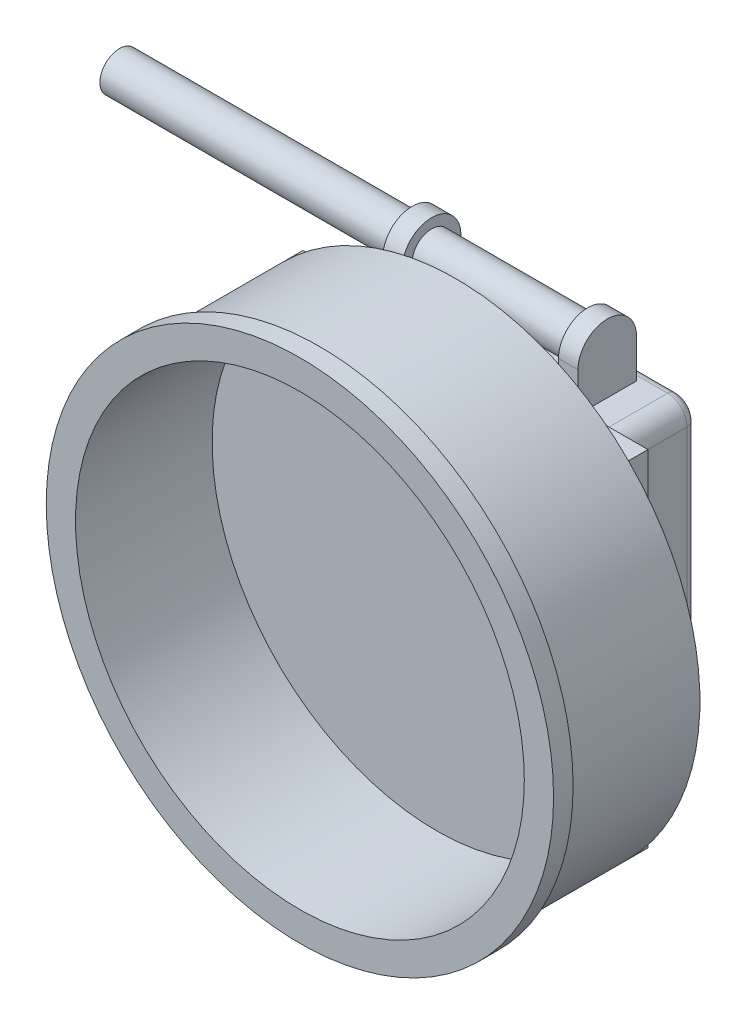
ISO-10303-21;
HEADER;
FILE_DESCRIPTION(('STEP AP214'),'2;1');
FILE_NAME('part.step','',(''),(''),'','','');
FILE_SCHEMA(('AUTOMOTIVE_DESIGN { 1 0 10303 214 1 1 1 1 }'));
ENDSEC;
DATA;
#1=APPLICATION_CONTEXT('core data for automotive mechanical design processes');
#2=APPLICATION_PROTOCOL_DEFINITION('international standard','automotive_design',2000,#1);
#3=PRODUCT_CONTEXT('',#1,'mechanical');
#4=PRODUCT('Part','Part','',(#3));
#5=PRODUCT_RELATED_PRODUCT_CATEGORY('part','',(#4));
#6=PRODUCT_DEFINITION_FORMATION('','',#4);
#7=PRODUCT_DEFINITION_CONTEXT('part definition',#1,'design');
#8=PRODUCT_DEFINITION('design','',#6,#7);
#9=PRODUCT_DEFINITION_SHAPE('','',#8);
#10=(LENGTH_UNIT() NAMED_UNIT(*) SI_UNIT(.MILLI.,.METRE.));
#11=(NAMED_UNIT(*) PLANE_ANGLE_UNIT() SI_UNIT($,.RADIAN.));
#12=(NAMED_UNIT(*) SI_UNIT($,.STERADIAN.) SOLID_ANGLE_UNIT());
#13=UNCERTAINTY_MEASURE_WITH_UNIT(LENGTH_MEASURE(1.E-05),#10,'distance_accuracy_value','');
#14=(GEOMETRIC_REPRESENTATION_CONTEXT(3) GLOBAL_UNCERTAINTY_ASSIGNED_CONTEXT((#13)) GLOBAL_UNIT_ASSIGNED_CONTEXT((#10,
#11,#12)) REPRESENTATION_CONTEXT('',''));
#15=CARTESIAN_POINT('',(0.,0.,0.));
#16=DIRECTION('',(0.,0.,1.));
#17=DIRECTION('',(1.,0.,0.));
#18=AXIS2_PLACEMENT_3D('',#15,#16,#17);
#19=CARTESIAN_POINT('',(0.,0.,-50.));
#20=DIRECTION('',(0.,0.,1.));
#21=DIRECTION('',(1.,0.,0.));
#22=AXIS2_PLACEMENT_3D('',#19,#20,#21);
#23=PLANE('',#22);
#24=CARTESIAN_POINT('',(-63.3883476483184,-73.3883476483185,-50.));
#25=DIRECTION('',(0.,0.,1.));
#26=DIRECTION('',(1.,0.,0.));
#27=AXIS2_PLACEMENT_3D('',#24,#25,#26);
#28=CIRCLE('',#27,5.);
#29=CARTESIAN_POINT('',(-68.3883476483184,-73.3883476483185,-50.));
#30=VERTEX_POINT('',#29);
#31=CARTESIAN_POINT('',(-63.3883476483184,-78.3883476483184,-50.));
#32=VERTEX_POINT('',#31);
#33=EDGE_CURVE('E377',#30,#32,#28,.T.);
#34=ORIENTED_EDGE('',*,*,#33,.F.);
#35=DIRECTION('',(0.,1.,0.));
#36=VECTOR('',#35,1.);
#37=CARTESIAN_POINT('',(-68.3883476483184,0.,-50.));
#38=LINE('',#37,#36);
#39=CARTESIAN_POINT('',(-68.3883476483184,73.3883476483184,-50.));
#40=VERTEX_POINT('',#39);
#41=EDGE_CURVE('E346',#30,#40,#38,.T.);
#42=ORIENTED_EDGE('',*,*,#41,.T.);
#43=CARTESIAN_POINT('',(-63.3883476483184,73.3883476483184,-50.));
#44=DIRECTION('',(0.,0.,1.));
#45=DIRECTION('',(1.,0.,0.));
#46=AXIS2_PLACEMENT_3D('',#43,#44,#45);
#47=CIRCLE('',#46,5.);
#48=CARTESIAN_POINT('',(-63.3883476483184,78.3883476483184,-50.));
#49=VERTEX_POINT('',#48);
#50=EDGE_CURVE('E375',#49,#40,#47,.T.);
#51=ORIENTED_EDGE('',*,*,#50,.F.);
#52=DIRECTION('',(1.,0.,0.));
#53=VECTOR('',#52,1.);
#54=CARTESIAN_POINT('',(0.,78.3883476483184,-50.));
#55=LINE('',#54,#53);
#56=CARTESIAN_POINT('',(63.3883476483184,78.3883476483184,-50.));
#57=VERTEX_POINT('',#56);
#58=EDGE_CURVE('E349',#49,#57,#55,.T.);
#59=ORIENTED_EDGE('',*,*,#58,.T.);
#60=CARTESIAN_POINT('',(63.3883476483184,73.3883476483184,-50.));
#61=DIRECTION('',(0.,0.,1.));
#62=DIRECTION('',(1.,0.,0.));
#63=AXIS2_PLACEMENT_3D('',#60,#61,#62);
#64=CIRCLE('',#63,5.);
#65=CARTESIAN_POINT('',(68.3883476483184,73.3883476483184,-50.));
#66=VERTEX_POINT('',#65);
#67=EDGE_CURVE('E372',#66,#57,#64,.T.);
#68=ORIENTED_EDGE('',*,*,#67,.F.);
#69=DIRECTION('',(0.,-1.,0.));
#70=VECTOR('',#69,1.);
#71=CARTESIAN_POINT('',(68.3883476483184,0.,-50.));
#72=LINE('',#71,#70);
#73=CARTESIAN_POINT('',(68.3883476483184,-73.3883476483184,-50.));
#74=VERTEX_POINT('',#73);
#75=EDGE_CURVE('E330',#66,#74,#72,.T.);
#76=ORIENTED_EDGE('',*,*,#75,.T.);
#77=CARTESIAN_POINT('',(63.3883476483184,-73.3883476483184,-50.));
#78=DIRECTION('',(0.,0.,1.));
#79=DIRECTION('',(1.,0.,0.));
#80=AXIS2_PLACEMENT_3D('',#77,#78,#79);
#81=CIRCLE('',#80,5.);
#82=CARTESIAN_POINT('',(63.3883476483184,-78.3883476483184,-50.));
#83=VERTEX_POINT('',#82);
#84=EDGE_CURVE('E369',#83,#74,#81,.T.);
#85=ORIENTED_EDGE('',*,*,#84,.F.);
#86=DIRECTION('',(-1.,0.,0.));
#87=VECTOR('',#86,1.);
#88=CARTESIAN_POINT('',(0.,-78.3883476483184,-50.));
#89=LINE('',#88,#87);
#90=EDGE_CURVE('E343',#83,#32,#89,.T.);
#91=ORIENTED_EDGE('',*,*,#90,.T.);
#92=EDGE_LOOP('',(#34,#42,#51,#59,#68,#76,#85,#91));
#93=FACE_BOUND('',#92,.T.);
#94=ADVANCED_FACE('F40',(#93),#23,.F.);
#95=CARTESIAN_POINT('',(0.,0.,0.));
#96=DIRECTION('',(0.,0.,1.));
#97=DIRECTION('',(1.,0.,0.));
#98=AXIS2_PLACEMENT_3D('',#95,#96,#97);
#99=PLANE('',#98);
#100=DIRECTION('',(0.,1.,0.));
#101=VECTOR('',#100,1.);
#102=CARTESIAN_POINT('',(-88.3883476483184,88.3883476483184,0.));
#103=LINE('',#102,#101);
#104=CARTESIAN_POINT('',(-88.3883476483185,-88.3883476483184,0.));
#105=VERTEX_POINT('',#104);
#106=CARTESIAN_POINT('',(-88.3883476483184,88.3883476483184,0.));
#107=VERTEX_POINT('',#106);
#108=EDGE_CURVE('E287',#105,#107,#103,.T.);
#109=ORIENTED_EDGE('',*,*,#108,.F.);
#110=CARTESIAN_POINT('',(0.,0.,0.));
#111=DIRECTION('',(0.,0.,1.));
#112=DIRECTION('',(1.,0.,0.));
#113=AXIS2_PLACEMENT_3D('',#110,#111,#112);
#114=CIRCLE('',#113,125.);
#115=EDGE_CURVE('E340',#107,#105,#114,.T.);
#116=ORIENTED_EDGE('',*,*,#115,.F.);
#117=EDGE_LOOP('',(#109,#116));
#118=FACE_BOUND('',#117,.T.);
#119=ADVANCED_FACE('F501',(#118),#99,.F.);
#120=DIRECTION('',(-1.,0.,0.));
#121=VECTOR('',#120,1.);
#122=CARTESIAN_POINT('',(88.3883476483184,-88.3883476483184,0.));
#123=LINE('',#122,#121);
#124=CARTESIAN_POINT('',(88.3883476483184,-88.3883476483184,0.));
#125=VERTEX_POINT('',#124);
#126=EDGE_CURVE('E292',#125,#105,#123,.T.);
#127=ORIENTED_EDGE('',*,*,#126,.F.);
#128=EDGE_CURVE('E975',#105,#125,#114,.T.);
#129=ORIENTED_EDGE('',*,*,#128,.F.);
#130=EDGE_LOOP('',(#127,#129));
#131=FACE_BOUND('',#130,.T.);
#132=ADVANCED_FACE('F506',(#131),#99,.F.);
#133=DIRECTION('',(0.,-1.,0.));
#134=VECTOR('',#133,1.);
#135=CARTESIAN_POINT('',(88.3883476483185,88.3883476483184,0.));
#136=LINE('',#135,#134);
#137=CARTESIAN_POINT('',(88.3883476483185,88.3883476483184,0.));
#138=VERTEX_POINT('',#137);
#139=EDGE_CURVE('E304',#138,#125,#136,.T.);
#140=ORIENTED_EDGE('',*,*,#139,.F.);
#141=EDGE_CURVE('E337',#125,#138,#114,.T.);
#142=ORIENTED_EDGE('',*,*,#141,.F.);
#143=EDGE_LOOP('',(#140,#142));
#144=FACE_BOUND('',#143,.T.);
#145=ADVANCED_FACE('F826',(#144),#99,.F.);
#146=DIRECTION('',(1.,0.,0.));
#147=VECTOR('',#146,1.);
#148=CARTESIAN_POINT('',(88.3883476483185,88.3883476483184,0.));
#149=LINE('',#148,#147);
#150=EDGE_CURVE('E301',#107,#138,#149,.T.);
#151=ORIENTED_EDGE('',*,*,#150,.F.);
#152=EDGE_CURVE('E331',#138,#107,#114,.T.);
#153=ORIENTED_EDGE('',*,*,#152,.F.);
#154=EDGE_LOOP('',(#151,#153));
#155=FACE_BOUND('',#154,.T.);
#156=ADVANCED_FACE('F509',(#155),#99,.F.);
#157=CARTESIAN_POINT('',(0.,0.,80.));
#158=DIRECTION('',(0.,0.,1.));
#159=DIRECTION('',(1.,0.,0.));
#160=AXIS2_PLACEMENT_3D('',#157,#158,#159);
#161=PLANE('',#160);
#162=CARTESIAN_POINT('',(0.,0.,80.));
#163=DIRECTION('',(0.,0.,1.));
#164=DIRECTION('',(1.,0.,0.));
#165=AXIS2_PLACEMENT_3D('',#162,#163,#164);
#166=CIRCLE('',#165,115.);
#167=CARTESIAN_POINT('',(115.,0.,80.));
#168=VERTEX_POINT('',#167);
#169=EDGE_CURVE('E334',#168,#168,#166,.T.);
#170=ORIENTED_EDGE('',*,*,#169,.F.);
#171=EDGE_LOOP('',(#170));
#172=FACE_BOUND('',#171,.T.);
#173=CARTESIAN_POINT('',(0.,0.,80.));
#174=DIRECTION('',(0.,0.,1.));
#175=DIRECTION('',(1.,0.,0.));
#176=AXIS2_PLACEMENT_3D('',#173,#174,#175);
#177=CIRCLE('',#176,130.);
#178=CARTESIAN_POINT('',(130.,0.,80.));
#179=VERTEX_POINT('',#178);
#180=EDGE_CURVE('E320',#179,#179,#177,.T.);
#181=ORIENTED_EDGE('',*,*,#180,.T.);
#182=EDGE_LOOP('',(#181));
#183=FACE_BOUND('',#182,.T.);
#184=ADVANCED_FACE('F841',(#172,#183),#161,.T.);
#185=CARTESIAN_POINT('',(0.,0.,80.));
#186=DIRECTION('',(0.,0.,-1.));
#187=DIRECTION('',(-1.,0.,0.));
#188=AXIS2_PLACEMENT_3D('',#185,#186,#187);
#189=CYLINDRICAL_SURFACE('',#188,115.);
#190=ORIENTED_EDGE('',*,*,#169,.T.);
#191=EDGE_LOOP('',(#190));
#192=FACE_BOUND('',#191,.T.);
#193=CARTESIAN_POINT('',(0.,0.,9.99999999999999));
#194=DIRECTION('',(0.,0.,1.));
#195=DIRECTION('',(1.,0.,0.));
#196=AXIS2_PLACEMENT_3D('',#193,#194,#195);
#197=CIRCLE('',#196,115.);
#198=CARTESIAN_POINT('',(115.,0.,9.99999999999999));
#199=VERTEX_POINT('',#198);
#200=EDGE_CURVE('E324',#199,#199,#197,.T.);
#201=ORIENTED_EDGE('',*,*,#200,.F.);
#202=EDGE_LOOP('',(#201));
#203=FACE_BOUND('',#202,.T.);
#204=ADVANCED_FACE('F869',(#192,#203),#189,.F.);
#205=CARTESIAN_POINT('',(0.,0.,10.));
#206=DIRECTION('',(0.,0.,1.));
#207=DIRECTION('',(1.,0.,0.));
#208=AXIS2_PLACEMENT_3D('',#205,#206,#207);
#209=PLANE('',#208);
#210=ORIENTED_EDGE('',*,*,#200,.T.);
#211=EDGE_LOOP('',(#210));
#212=FACE_BOUND('',#211,.T.);
#213=ADVANCED_FACE('F858',(#212),#209,.T.);
#214=CARTESIAN_POINT('',(0.,0.,70.));
#215=DIRECTION('',(0.,0.,1.));
#216=DIRECTION('',(1.,0.,0.));
#217=AXIS2_PLACEMENT_3D('',#214,#215,#216);
#218=PLANE('',#217);
#219=CARTESIAN_POINT('',(0.,0.,70.));
#220=DIRECTION('',(0.,0.,1.));
#221=DIRECTION('',(1.,0.,0.));
#222=AXIS2_PLACEMENT_3D('',#219,#220,#221);
#223=CIRCLE('',#222,130.);
#224=CARTESIAN_POINT('',(130.,0.,70.));
#225=VERTEX_POINT('',#224);
#226=EDGE_CURVE('E321',#225,#225,#223,.T.);
#227=ORIENTED_EDGE('',*,*,#226,.F.);
#228=EDGE_LOOP('',(#227));
#229=FACE_BOUND('',#228,.T.);
#230=CARTESIAN_POINT('',(0.,0.,70.));
#231=DIRECTION('',(0.,0.,1.));
#232=DIRECTION('',(1.,0.,0.));
#233=AXIS2_PLACEMENT_3D('',#230,#231,#232);
#234=CIRCLE('',#233,125.);
#235=CARTESIAN_POINT('',(125.,0.,70.));
#236=VERTEX_POINT('',#235);
#237=EDGE_CURVE('E327',#236,#236,#234,.T.);
#238=ORIENTED_EDGE('',*,*,#237,.T.);
#239=EDGE_LOOP('',(#238));
#240=FACE_BOUND('',#239,.T.);
#241=ADVANCED_FACE('F849',(#229,#240),#218,.F.);
#242=CARTESIAN_POINT('',(0.,0.,70.));
#243=DIRECTION('',(0.,0.,1.));
#244=DIRECTION('',(1.,0.,0.));
#245=AXIS2_PLACEMENT_3D('',#242,#243,#244);
#246=CYLINDRICAL_SURFACE('',#245,130.);
#247=ORIENTED_EDGE('',*,*,#226,.T.);
#248=EDGE_LOOP('',(#247));
#249=FACE_BOUND('',#248,.T.);
#250=ORIENTED_EDGE('',*,*,#180,.F.);
#251=EDGE_LOOP('',(#250));
#252=FACE_BOUND('',#251,.T.);
#253=ADVANCED_FACE('F844',(#249,#252),#246,.T.);
#254=CARTESIAN_POINT('',(0.,0.,80.));
#255=DIRECTION('',(0.,0.,-1.));
#256=DIRECTION('',(-1.,0.,0.));
#257=AXIS2_PLACEMENT_3D('',#254,#255,#256);
#258=CYLINDRICAL_SURFACE('',#257,125.);
#259=ORIENTED_EDGE('',*,*,#152,.T.);
#260=ORIENTED_EDGE('',*,*,#115,.T.);
#261=ORIENTED_EDGE('',*,*,#128,.T.);
#262=ORIENTED_EDGE('',*,*,#141,.T.);
#263=EDGE_LOOP('',(#259,#260,#261,#262));
#264=FACE_BOUND('',#263,.T.);
#265=ORIENTED_EDGE('',*,*,#237,.F.);
#266=EDGE_LOOP('',(#265));
#267=FACE_BOUND('',#266,.T.);
#268=ADVANCED_FACE('F810',(#264,#267),#258,.T.);
#269=CARTESIAN_POINT('',(-88.3883476483184,88.3883476483184,-10.));
#270=DIRECTION('',(1.,0.,0.));
#271=DIRECTION('',(0.,0.,-1.));
#272=AXIS2_PLACEMENT_3D('',#269,#270,#271);
#273=PLANE('',#272);
#274=ORIENTED_EDGE('',*,*,#108,.T.);
#275=DIRECTION('',(0.,0.,1.));
#276=VECTOR('',#275,1.);
#277=CARTESIAN_POINT('',(-88.3883476483184,88.3883476483184,-10.));
#278=LINE('',#277,#276);
#279=CARTESIAN_POINT('',(-88.3883476483184,88.3883476483184,-10.));
#280=VERTEX_POINT('',#279);
#281=EDGE_CURVE('E317',#280,#107,#278,.T.);
#282=ORIENTED_EDGE('',*,*,#281,.F.);
#283=DIRECTION('',(0.,1.,0.));
#284=VECTOR('',#283,1.);
#285=CARTESIAN_POINT('',(-88.3883476483184,88.3883476483184,-10.));
#286=LINE('',#285,#284);
#287=CARTESIAN_POINT('',(-88.3883476483184,-88.3883476483184,-10.));
#288=VERTEX_POINT('',#287);
#289=EDGE_CURVE('E288',#288,#280,#286,.T.);
#290=ORIENTED_EDGE('',*,*,#289,.F.);
#291=DIRECTION('',(0.,0.,1.));
#292=VECTOR('',#291,1.);
#293=CARTESIAN_POINT('',(-88.3883476483184,-88.3883476483184,-10.));
#294=LINE('',#293,#292);
#295=EDGE_CURVE('E298',#288,#105,#294,.T.);
#296=ORIENTED_EDGE('',*,*,#295,.T.);
#297=EDGE_LOOP('',(#274,#282,#290,#296));
#298=FACE_BOUND('',#297,.T.);
#299=ADVANCED_FACE('F801',(#298),#273,.F.);
#300=CARTESIAN_POINT('',(88.3883476483185,88.3883476483184,-10.));
#301=DIRECTION('',(0.,-1.,0.));
#302=DIRECTION('',(0.,0.,-1.));
#303=AXIS2_PLACEMENT_3D('',#300,#301,#302);
#304=PLANE('',#303);
#305=ORIENTED_EDGE('',*,*,#150,.T.);
#306=DIRECTION('',(0.,0.,1.));
#307=VECTOR('',#306,1.);
#308=CARTESIAN_POINT('',(88.3883476483185,88.3883476483184,-10.));
#309=LINE('',#308,#307);
#310=CARTESIAN_POINT('',(88.3883476483185,88.3883476483184,-10.));
#311=VERTEX_POINT('',#310);
#312=EDGE_CURVE('E314',#311,#138,#309,.T.);
#313=ORIENTED_EDGE('',*,*,#312,.F.);
#314=DIRECTION('',(1.,0.,0.));
#315=VECTOR('',#314,1.);
#316=CARTESIAN_POINT('',(88.3883476483185,88.3883476483184,-10.));
#317=LINE('',#316,#315);
#318=EDGE_CURVE('E291',#280,#311,#317,.T.);
#319=ORIENTED_EDGE('',*,*,#318,.F.);
#320=ORIENTED_EDGE('',*,*,#281,.T.);
#321=EDGE_LOOP('',(#305,#313,#319,#320));
#322=FACE_BOUND('',#321,.T.);
#323=ADVANCED_FACE('F792',(#322),#304,.F.);
#324=CARTESIAN_POINT('',(88.3883476483185,88.3883476483184,-10.));
#325=DIRECTION('',(-1.,0.,0.));
#326=DIRECTION('',(0.,-1.,0.));
#327=AXIS2_PLACEMENT_3D('',#324,#325,#326);
#328=PLANE('',#327);
#329=ORIENTED_EDGE('',*,*,#139,.T.);
#330=DIRECTION('',(0.,0.,1.));
#331=VECTOR('',#330,1.);
#332=CARTESIAN_POINT('',(88.3883476483184,-88.3883476483184,-10.));
#333=LINE('',#332,#331);
#334=CARTESIAN_POINT('',(88.3883476483184,-88.3883476483184,-10.));
#335=VERTEX_POINT('',#334);
#336=EDGE_CURVE('E311',#335,#125,#333,.T.);
#337=ORIENTED_EDGE('',*,*,#336,.F.);
#338=DIRECTION('',(0.,-1.,0.));
#339=VECTOR('',#338,1.);
#340=CARTESIAN_POINT('',(88.3883476483185,88.3883476483184,-10.));
#341=LINE('',#340,#339);
#342=EDGE_CURVE('E294',#311,#335,#341,.T.);
#343=ORIENTED_EDGE('',*,*,#342,.F.);
#344=ORIENTED_EDGE('',*,*,#312,.T.);
#345=EDGE_LOOP('',(#329,#337,#343,#344));
#346=FACE_BOUND('',#345,.T.);
#347=ADVANCED_FACE('F783',(#346),#328,.F.);
#348=CARTESIAN_POINT('',(88.3883476483184,-88.3883476483184,-10.));
#349=DIRECTION('',(0.,1.,0.));
#350=DIRECTION('',(0.,0.,1.));
#351=AXIS2_PLACEMENT_3D('',#348,#349,#350);
#352=PLANE('',#351);
#353=ORIENTED_EDGE('',*,*,#126,.T.);
#354=ORIENTED_EDGE('',*,*,#295,.F.);
#355=DIRECTION('',(-1.,0.,0.));
#356=VECTOR('',#355,1.);
#357=CARTESIAN_POINT('',(88.3883476483184,-88.3883476483184,-10.));
#358=LINE('',#357,#356);
#359=EDGE_CURVE('E296',#335,#288,#358,.T.);
#360=ORIENTED_EDGE('',*,*,#359,.F.);
#361=ORIENTED_EDGE('',*,*,#336,.T.);
#362=EDGE_LOOP('',(#353,#354,#360,#361));
#363=FACE_BOUND('',#362,.T.);
#364=ADVANCED_FACE('F776',(#363),#352,.F.);
#365=CARTESIAN_POINT('',(0.,0.,-10.));
#366=DIRECTION('',(0.,0.,-1.));
#367=DIRECTION('',(-1.,0.,0.));
#368=AXIS2_PLACEMENT_3D('',#365,#366,#367);
#369=PLANE('',#368);
#370=DIRECTION('',(0.,-1.,0.));
#371=VECTOR('',#370,1.);
#372=CARTESIAN_POINT('',(73.3883476483184,83.3883476483184,-10.));
#373=LINE('',#372,#371);
#374=CARTESIAN_POINT('',(73.3883476483184,73.3883476483184,-10.));
#375=VERTEX_POINT('',#374);
#376=CARTESIAN_POINT('',(73.3883476483184,-73.3883476483185,-10.));
#377=VERTEX_POINT('',#376);
#378=EDGE_CURVE('E274',#375,#377,#373,.T.);
#379=ORIENTED_EDGE('',*,*,#378,.F.);
#380=CARTESIAN_POINT('',(63.3883476483184,73.3883476483184,-10.));
#381=DIRECTION('',(0.,0.,-1.));
#382=DIRECTION('',(-1.,0.,0.));
#383=AXIS2_PLACEMENT_3D('',#380,#381,#382);
#384=CIRCLE('',#383,10.);
#385=CARTESIAN_POINT('',(63.3883476483184,83.3883476483184,-10.));
#386=VERTEX_POINT('',#385);
#387=EDGE_CURVE('E410',#375,#386,#384,.F.);
#388=ORIENTED_EDGE('',*,*,#387,.T.);
#389=DIRECTION('',(1.,0.,0.));
#390=VECTOR('',#389,1.);
#391=CARTESIAN_POINT('',(-73.3883476483184,83.3883476483184,-10.));
#392=LINE('',#391,#390);
#393=CARTESIAN_POINT('',(-63.3883476483184,83.3883476483184,-10.));
#394=VERTEX_POINT('',#393);
#395=EDGE_CURVE('E284',#394,#386,#392,.T.);
#396=ORIENTED_EDGE('',*,*,#395,.F.);
#397=CARTESIAN_POINT('',(-63.3883476483184,73.3883476483184,-10.));
#398=DIRECTION('',(0.,0.,-1.));
#399=DIRECTION('',(-1.,0.,0.));
#400=AXIS2_PLACEMENT_3D('',#397,#398,#399);
#401=CIRCLE('',#400,10.);
#402=CARTESIAN_POINT('',(-73.3883476483184,73.3883476483184,-10.));
#403=VERTEX_POINT('',#402);
#404=EDGE_CURVE('E412',#394,#403,#401,.F.);
#405=ORIENTED_EDGE('',*,*,#404,.T.);
#406=DIRECTION('',(0.,1.,0.));
#407=VECTOR('',#406,1.);
#408=CARTESIAN_POINT('',(-73.3883476483184,83.3883476483184,-10.));
#409=LINE('',#408,#407);
#410=CARTESIAN_POINT('',(-73.3883476483184,-73.3883476483185,-10.));
#411=VERTEX_POINT('',#410);
#412=EDGE_CURVE('E281',#411,#403,#409,.T.);
#413=ORIENTED_EDGE('',*,*,#412,.F.);
#414=CARTESIAN_POINT('',(-63.3883476483184,-73.3883476483185,-10.));
#415=DIRECTION('',(0.,0.,-1.));
#416=DIRECTION('',(-1.,0.,0.));
#417=AXIS2_PLACEMENT_3D('',#414,#415,#416);
#418=CIRCLE('',#417,10.);
#419=CARTESIAN_POINT('',(-63.3883476483184,-83.3883476483184,-10.));
#420=VERTEX_POINT('',#419);
#421=EDGE_CURVE('E49',#411,#420,#418,.F.);
#422=ORIENTED_EDGE('',*,*,#421,.T.);
#423=DIRECTION('',(-1.,0.,0.));
#424=VECTOR('',#423,1.);
#425=CARTESIAN_POINT('',(-73.3883476483184,-83.3883476483184,-10.));
#426=LINE('',#425,#424);
#427=CARTESIAN_POINT('',(63.3883476483184,-83.3883476483184,-10.));
#428=VERTEX_POINT('',#427);
#429=EDGE_CURVE('E277',#428,#420,#426,.T.);
#430=ORIENTED_EDGE('',*,*,#429,.F.);
#431=CARTESIAN_POINT('',(63.3883476483184,-73.3883476483184,-10.));
#432=DIRECTION('',(0.,0.,-1.));
#433=DIRECTION('',(-1.,0.,0.));
#434=AXIS2_PLACEMENT_3D('',#431,#432,#433);
#435=CIRCLE('',#434,10.);
#436=EDGE_CURVE('E408',#428,#377,#435,.F.);
#437=ORIENTED_EDGE('',*,*,#436,.T.);
#438=EDGE_LOOP('',(#379,#388,#396,#405,#413,#422,#430,#437));
#439=FACE_BOUND('',#438,.T.);
#440=ORIENTED_EDGE('',*,*,#289,.T.);
#441=ORIENTED_EDGE('',*,*,#318,.T.);
#442=ORIENTED_EDGE('',*,*,#342,.T.);
#443=ORIENTED_EDGE('',*,*,#359,.T.);
#444=EDGE_LOOP('',(#440,#441,#442,#443));
#445=FACE_BOUND('',#444,.T.);
#446=ADVANCED_FACE('F439',(#439,#445),#369,.T.);
#447=CARTESIAN_POINT('',(73.3883476483184,83.3883476483184,-50.));
#448=DIRECTION('',(-1.,0.,0.));
#449=DIRECTION('',(0.,0.,1.));
#450=AXIS2_PLACEMENT_3D('',#447,#448,#449);
#451=PLANE('',#450);
#452=ORIENTED_EDGE('',*,*,#378,.T.);
#453=DIRECTION('',(0.,0.,1.));
#454=VECTOR('',#453,1.);
#455=CARTESIAN_POINT('',(73.3883476483184,-73.3883476483185,-50.));
#456=LINE('',#455,#454);
#457=CARTESIAN_POINT('',(73.3883476483184,-73.3883476483185,-45.));
#458=VERTEX_POINT('',#457);
#459=EDGE_CURVE('E398',#377,#458,#456,.F.);
#460=ORIENTED_EDGE('',*,*,#459,.T.);
#461=DIRECTION('',(0.,-1.,0.));
#462=VECTOR('',#461,1.);
#463=CARTESIAN_POINT('',(73.3883476483184,83.3883476483184,-45.));
#464=LINE('',#463,#462);
#465=CARTESIAN_POINT('',(73.3883476483184,73.3883476483184,-45.));
#466=VERTEX_POINT('',#465);
#467=EDGE_CURVE('E361',#458,#466,#464,.F.);
#468=ORIENTED_EDGE('',*,*,#467,.T.);
#469=DIRECTION('',(0.,0.,1.));
#470=VECTOR('',#469,1.);
#471=CARTESIAN_POINT('',(73.3883476483184,73.3883476483184,-50.));
#472=LINE('',#471,#470);
#473=EDGE_CURVE('E396',#466,#375,#472,.T.);
#474=ORIENTED_EDGE('',*,*,#473,.T.);
#475=EDGE_LOOP('',(#452,#460,#468,#474));
#476=FACE_BOUND('',#475,.T.);
#477=ADVANCED_FACE('F460',(#476),#451,.F.);
#478=CARTESIAN_POINT('',(-73.3883476483184,-83.3883476483184,-50.));
#479=DIRECTION('',(0.,1.,0.));
#480=DIRECTION('',(0.,0.,1.));
#481=AXIS2_PLACEMENT_3D('',#478,#479,#480);
#482=PLANE('',#481);
#483=DIRECTION('',(-1.,0.,0.));
#484=VECTOR('',#483,1.);
#485=CARTESIAN_POINT('',(-73.3883476483184,-83.3883476483184,-45.));
#486=LINE('',#485,#484);
#487=CARTESIAN_POINT('',(-63.3883476483184,-83.3883476483184,-45.));
#488=VERTEX_POINT('',#487);
#489=CARTESIAN_POINT('',(63.3883476483184,-83.3883476483184,-45.));
#490=VERTEX_POINT('',#489);
#491=EDGE_CURVE('E358',#488,#490,#486,.F.);
#492=ORIENTED_EDGE('',*,*,#491,.T.);
#493=DIRECTION('',(0.,0.,1.));
#494=VECTOR('',#493,1.);
#495=CARTESIAN_POINT('',(63.3883476483184,-83.3883476483184,-50.));
#496=LINE('',#495,#494);
#497=EDGE_CURVE('E394',#490,#428,#496,.T.);
#498=ORIENTED_EDGE('',*,*,#497,.T.);
#499=ORIENTED_EDGE('',*,*,#429,.T.);
#500=DIRECTION('',(0.,0.,1.));
#501=VECTOR('',#500,1.);
#502=CARTESIAN_POINT('',(-63.3883476483184,-83.3883476483184,-50.));
#503=LINE('',#502,#501);
#504=EDGE_CURVE('E392',#420,#488,#503,.F.);
#505=ORIENTED_EDGE('',*,*,#504,.T.);
#506=EDGE_LOOP('',(#492,#498,#499,#505));
#507=FACE_BOUND('',#506,.T.);
#508=ADVANCED_FACE('F434',(#507),#482,.F.);
#509=CARTESIAN_POINT('',(-73.3883476483184,83.3883476483184,-50.));
#510=DIRECTION('',(1.,0.,0.));
#511=DIRECTION('',(0.,0.,-1.));
#512=AXIS2_PLACEMENT_3D('',#509,#510,#511);
#513=PLANE('',#512);
#514=ORIENTED_EDGE('',*,*,#412,.T.);
#515=DIRECTION('',(0.,0.,1.));
#516=VECTOR('',#515,1.);
#517=CARTESIAN_POINT('',(-73.3883476483184,73.3883476483184,-50.));
#518=LINE('',#517,#516);
#519=CARTESIAN_POINT('',(-73.3883476483184,73.3883476483184,-45.));
#520=VERTEX_POINT('',#519);
#521=EDGE_CURVE('E406',#403,#520,#518,.F.);
#522=ORIENTED_EDGE('',*,*,#521,.T.);
#523=DIRECTION('',(0.,1.,0.));
#524=VECTOR('',#523,1.);
#525=CARTESIAN_POINT('',(-73.3883476483184,83.3883476483184,-45.));
#526=LINE('',#525,#524);
#527=CARTESIAN_POINT('',(-73.3883476483184,-73.3883476483185,-45.));
#528=VERTEX_POINT('',#527);
#529=EDGE_CURVE('E355',#520,#528,#526,.F.);
#530=ORIENTED_EDGE('',*,*,#529,.T.);
#531=DIRECTION('',(0.,0.,1.));
#532=VECTOR('',#531,1.);
#533=CARTESIAN_POINT('',(-73.3883476483184,-73.3883476483185,-50.));
#534=LINE('',#533,#532);
#535=EDGE_CURVE('E404',#528,#411,#534,.T.);
#536=ORIENTED_EDGE('',*,*,#535,.T.);
#537=EDGE_LOOP('',(#514,#522,#530,#536));
#538=FACE_BOUND('',#537,.T.);
#539=ADVANCED_FACE('F491',(#538),#513,.F.);
#540=CARTESIAN_POINT('',(-73.3883476483184,83.3883476483184,-50.));
#541=DIRECTION('',(0.,-1.,0.));
#542=DIRECTION('',(0.,0.,-1.));
#543=AXIS2_PLACEMENT_3D('',#540,#541,#542);
#544=PLANE('',#543);
#545=DIRECTION('',(1.,0.,0.));
#546=VECTOR('',#545,1.);
#547=CARTESIAN_POINT('',(-50.,83.3883476483184,-12.5));
#548=LINE('',#547,#546);
#549=CARTESIAN_POINT('',(-50.,83.3883476483184,-12.5));
#550=VERTEX_POINT('',#549);
#551=CARTESIAN_POINT('',(-40.,83.3883476483184,-12.5));
#552=VERTEX_POINT('',#551);
#553=EDGE_CURVE('E62',#550,#552,#548,.T.);
#554=ORIENTED_EDGE('',*,*,#553,.F.);
#555=DIRECTION('',(0.,0.,-1.));
#556=VECTOR('',#555,1.);
#557=CARTESIAN_POINT('',(-50.,83.3883476483184,-12.5));
#558=LINE('',#557,#556);
#559=CARTESIAN_POINT('',(-50.,83.3883476483184,-42.5));
#560=VERTEX_POINT('',#559);
#561=EDGE_CURVE('E57',#550,#560,#558,.T.);
#562=ORIENTED_EDGE('',*,*,#561,.T.);
#563=DIRECTION('',(1.,0.,0.));
#564=VECTOR('',#563,1.);
#565=CARTESIAN_POINT('',(-50.,83.3883476483184,-42.5));
#566=LINE('',#565,#564);
#567=CARTESIAN_POINT('',(-40.,83.3883476483184,-42.5));
#568=VERTEX_POINT('',#567);
#569=EDGE_CURVE('E213',#560,#568,#566,.T.);
#570=ORIENTED_EDGE('',*,*,#569,.T.);
#571=DIRECTION('',(0.,0.,-1.));
#572=VECTOR('',#571,1.);
#573=CARTESIAN_POINT('',(-40.,83.3883476483184,-12.5));
#574=LINE('',#573,#572);
#575=EDGE_CURVE('E234',#552,#568,#574,.T.);
#576=ORIENTED_EDGE('',*,*,#575,.F.);
#577=EDGE_LOOP('',(#554,#562,#570,#576));
#578=FACE_BOUND('',#577,.T.);
#579=DIRECTION('',(-1.,0.,0.));
#580=VECTOR('',#579,1.);
#581=CARTESIAN_POINT('',(50.,83.3883476483184,-42.5));
#582=LINE('',#581,#580);
#583=CARTESIAN_POINT('',(50.,83.3883476483184,-42.5));
#584=VERTEX_POINT('',#583);
#585=CARTESIAN_POINT('',(40.,83.3883476483184,-42.5));
#586=VERTEX_POINT('',#585);
#587=EDGE_CURVE('E265',#584,#586,#582,.T.);
#588=ORIENTED_EDGE('',*,*,#587,.F.);
#589=DIRECTION('',(0.,0.,-1.));
#590=VECTOR('',#589,1.);
#591=CARTESIAN_POINT('',(50.,83.3883476483184,-12.5));
#592=LINE('',#591,#590);
#593=CARTESIAN_POINT('',(50.,83.3883476483184,-12.5));
#594=VERTEX_POINT('',#593);
#595=EDGE_CURVE('E249',#594,#584,#592,.T.);
#596=ORIENTED_EDGE('',*,*,#595,.F.);
#597=DIRECTION('',(-1.,0.,0.));
#598=VECTOR('',#597,1.);
#599=CARTESIAN_POINT('',(50.,83.3883476483184,-12.5));
#600=LINE('',#599,#598);
#601=CARTESIAN_POINT('',(40.,83.3883476483184,-12.5));
#602=VERTEX_POINT('',#601);
#603=EDGE_CURVE('E268',#594,#602,#600,.T.);
#604=ORIENTED_EDGE('',*,*,#603,.T.);
#605=DIRECTION('',(0.,0.,-1.));
#606=VECTOR('',#605,1.);
#607=CARTESIAN_POINT('',(40.,83.3883476483184,-12.5));
#608=LINE('',#607,#606);
#609=EDGE_CURVE('E260',#602,#586,#608,.T.);
#610=ORIENTED_EDGE('',*,*,#609,.T.);
#611=EDGE_LOOP('',(#588,#596,#604,#610));
#612=FACE_BOUND('',#611,.T.);
#613=ORIENTED_EDGE('',*,*,#395,.T.);
#614=DIRECTION('',(0.,0.,1.));
#615=VECTOR('',#614,1.);
#616=CARTESIAN_POINT('',(63.3883476483184,83.3883476483184,-50.));
#617=LINE('',#616,#615);
#618=CARTESIAN_POINT('',(63.3883476483184,83.3883476483184,-45.));
#619=VERTEX_POINT('',#618);
#620=EDGE_CURVE('E402',#386,#619,#617,.F.);
#621=ORIENTED_EDGE('',*,*,#620,.T.);
#622=DIRECTION('',(1.,0.,0.));
#623=VECTOR('',#622,1.);
#624=CARTESIAN_POINT('',(-73.3883476483184,83.3883476483184,-45.));
#625=LINE('',#624,#623);
#626=CARTESIAN_POINT('',(-63.3883476483184,83.3883476483184,-45.));
#627=VERTEX_POINT('',#626);
#628=EDGE_CURVE('E352',#619,#627,#625,.F.);
#629=ORIENTED_EDGE('',*,*,#628,.T.);
#630=DIRECTION('',(0.,0.,1.));
#631=VECTOR('',#630,1.);
#632=CARTESIAN_POINT('',(-63.3883476483184,83.3883476483184,-50.));
#633=LINE('',#632,#631);
#634=EDGE_CURVE('E400',#627,#394,#633,.T.);
#635=ORIENTED_EDGE('',*,*,#634,.T.);
#636=EDGE_LOOP('',(#613,#621,#629,#635));
#637=FACE_BOUND('',#636,.T.);
#638=ADVANCED_FACE('F490',(#578,#612,#637),#544,.F.);
#639=CARTESIAN_POINT('',(0.,-78.3883476483184,-45.));
#640=DIRECTION('',(-1.,0.,0.));
#641=DIRECTION('',(0.,0.,1.));
#642=AXIS2_PLACEMENT_3D('',#639,#640,#641);
#643=CYLINDRICAL_SURFACE('',#642,5.);
#644=ORIENTED_EDGE('',*,*,#491,.F.);
#645=CARTESIAN_POINT('',(-63.3883476483184,-78.3883476483184,-45.));
#646=DIRECTION('',(1.,0.,0.));
#647=DIRECTION('',(0.,0.,-1.));
#648=AXIS2_PLACEMENT_3D('',#645,#646,#647);
#649=CIRCLE('',#648,5.);
#650=EDGE_CURVE('E366',#488,#32,#649,.T.);
#651=ORIENTED_EDGE('',*,*,#650,.T.);
#652=ORIENTED_EDGE('',*,*,#90,.F.);
#653=CARTESIAN_POINT('',(63.3883476483184,-78.3883476483184,-45.));
#654=DIRECTION('',(-1.,0.,0.));
#655=DIRECTION('',(0.,0.,1.));
#656=AXIS2_PLACEMENT_3D('',#653,#654,#655);
#657=CIRCLE('',#656,5.);
#658=EDGE_CURVE('E364',#83,#490,#657,.T.);
#659=ORIENTED_EDGE('',*,*,#658,.T.);
#660=EDGE_LOOP('',(#644,#651,#652,#659));
#661=FACE_BOUND('',#660,.T.);
#662=ADVANCED_FACE('F449',(#661),#643,.T.);
#663=CARTESIAN_POINT('',(-68.3883476483184,0.,-45.));
#664=DIRECTION('',(0.,1.,0.));
#665=DIRECTION('',(0.,0.,1.));
#666=AXIS2_PLACEMENT_3D('',#663,#664,#665);
#667=CYLINDRICAL_SURFACE('',#666,5.);
#668=ORIENTED_EDGE('',*,*,#529,.F.);
#669=CARTESIAN_POINT('',(-68.3883476483184,73.3883476483184,-45.));
#670=DIRECTION('',(0.,-1.,0.));
#671=DIRECTION('',(0.,0.,-1.));
#672=AXIS2_PLACEMENT_3D('',#669,#670,#671);
#673=CIRCLE('',#672,5.);
#674=EDGE_CURVE('E381',#520,#40,#673,.T.);
#675=ORIENTED_EDGE('',*,*,#674,.T.);
#676=ORIENTED_EDGE('',*,*,#41,.F.);
#677=CARTESIAN_POINT('',(-68.3883476483184,-73.3883476483185,-45.));
#678=DIRECTION('',(0.,1.,0.));
#679=DIRECTION('',(0.,0.,1.));
#680=AXIS2_PLACEMENT_3D('',#677,#678,#679);
#681=CIRCLE('',#680,5.);
#682=EDGE_CURVE('E379',#30,#528,#681,.T.);
#683=ORIENTED_EDGE('',*,*,#682,.T.);
#684=EDGE_LOOP('',(#668,#675,#676,#683));
#685=FACE_BOUND('',#684,.T.);
#686=ADVANCED_FACE('F479',(#685),#667,.T.);
#687=CARTESIAN_POINT('',(68.3883476483184,0.,-45.));
#688=DIRECTION('',(0.,-1.,0.));
#689=DIRECTION('',(0.,0.,-1.));
#690=AXIS2_PLACEMENT_3D('',#687,#688,#689);
#691=CYLINDRICAL_SURFACE('',#690,5.);
#692=ORIENTED_EDGE('',*,*,#467,.F.);
#693=CARTESIAN_POINT('',(68.3883476483184,-73.3883476483184,-45.));
#694=DIRECTION('',(0.,1.,0.));
#695=DIRECTION('',(0.,0.,1.));
#696=AXIS2_PLACEMENT_3D('',#693,#694,#695);
#697=CIRCLE('',#696,5.);
#698=EDGE_CURVE('E390',#458,#74,#697,.T.);
#699=ORIENTED_EDGE('',*,*,#698,.T.);
#700=ORIENTED_EDGE('',*,*,#75,.F.);
#701=CARTESIAN_POINT('',(68.3883476483184,73.3883476483184,-45.));
#702=DIRECTION('',(0.,-1.,0.));
#703=DIRECTION('',(0.,0.,-1.));
#704=AXIS2_PLACEMENT_3D('',#701,#702,#703);
#705=CIRCLE('',#704,5.);
#706=EDGE_CURVE('E388',#66,#466,#705,.T.);
#707=ORIENTED_EDGE('',*,*,#706,.T.);
#708=EDGE_LOOP('',(#692,#699,#700,#707));
#709=FACE_BOUND('',#708,.T.);
#710=ADVANCED_FACE('F457',(#709),#691,.T.);
#711=CARTESIAN_POINT('',(0.,78.3883476483184,-45.));
#712=DIRECTION('',(1.,0.,0.));
#713=DIRECTION('',(0.,0.,-1.));
#714=AXIS2_PLACEMENT_3D('',#711,#712,#713);
#715=CYLINDRICAL_SURFACE('',#714,5.);
#716=ORIENTED_EDGE('',*,*,#628,.F.);
#717=CARTESIAN_POINT('',(63.3883476483184,78.3883476483184,-45.));
#718=DIRECTION('',(-1.,0.,0.));
#719=DIRECTION('',(0.,0.,1.));
#720=AXIS2_PLACEMENT_3D('',#717,#718,#719);
#721=CIRCLE('',#720,5.);
#722=EDGE_CURVE('E386',#619,#57,#721,.T.);
#723=ORIENTED_EDGE('',*,*,#722,.T.);
#724=ORIENTED_EDGE('',*,*,#58,.F.);
#725=CARTESIAN_POINT('',(-63.3883476483184,78.3883476483184,-45.));
#726=DIRECTION('',(1.,0.,0.));
#727=DIRECTION('',(0.,0.,-1.));
#728=AXIS2_PLACEMENT_3D('',#725,#726,#727);
#729=CIRCLE('',#728,5.);
#730=EDGE_CURVE('E384',#49,#627,#729,.T.);
#731=ORIENTED_EDGE('',*,*,#730,.T.);
#732=EDGE_LOOP('',(#716,#723,#724,#731));
#733=FACE_BOUND('',#732,.T.);
#734=ADVANCED_FACE('F472',(#733),#715,.T.);
#735=CARTESIAN_POINT('',(-63.3883476483184,-73.3883476483185,-50.));
#736=DIRECTION('',(0.,0.,1.));
#737=DIRECTION('',(1.,0.,0.));
#738=AXIS2_PLACEMENT_3D('',#735,#736,#737);
#739=CYLINDRICAL_SURFACE('',#738,10.);
#740=ORIENTED_EDGE('',*,*,#421,.F.);
#741=ORIENTED_EDGE('',*,*,#535,.F.);
#742=CARTESIAN_POINT('',(-63.3883476483184,-73.3883476483185,-45.));
#743=DIRECTION('',(0.,0.,1.));
#744=DIRECTION('',(1.,0.,0.));
#745=AXIS2_PLACEMENT_3D('',#742,#743,#744);
#746=CIRCLE('',#745,10.);
#747=EDGE_CURVE('E278',#488,#528,#746,.F.);
#748=ORIENTED_EDGE('',*,*,#747,.F.);
#749=ORIENTED_EDGE('',*,*,#504,.F.);
#750=EDGE_LOOP('',(#740,#741,#748,#749));
#751=FACE_BOUND('',#750,.T.);
#752=ADVANCED_FACE('F445',(#751),#739,.T.);
#753=CARTESIAN_POINT('',(-63.3883476483184,-73.3883476483185,-45.));
#754=DIRECTION('',(0.,0.,1.));
#755=DIRECTION('',(1.,0.,0.));
#756=AXIS2_PLACEMENT_3D('',#753,#754,#755);
#757=DEGENERATE_TOROIDAL_SURFACE('',#756,5.,5.,.T.);
#758=ORIENTED_EDGE('',*,*,#650,.F.);
#759=ORIENTED_EDGE('',*,*,#747,.T.);
#760=ORIENTED_EDGE('',*,*,#682,.F.);
#761=ORIENTED_EDGE('',*,*,#33,.T.);
#762=EDGE_LOOP('',(#758,#759,#760,#761));
#763=FACE_BOUND('',#762,.T.);
#764=ADVANCED_FACE('F699',(#763),#757,.T.);
#765=CARTESIAN_POINT('',(-63.3883476483184,73.3883476483184,-50.));
#766=DIRECTION('',(0.,0.,1.));
#767=DIRECTION('',(1.,0.,0.));
#768=AXIS2_PLACEMENT_3D('',#765,#766,#767);
#769=CYLINDRICAL_SURFACE('',#768,10.);
#770=ORIENTED_EDGE('',*,*,#404,.F.);
#771=ORIENTED_EDGE('',*,*,#634,.F.);
#772=CARTESIAN_POINT('',(-63.3883476483184,73.3883476483184,-45.));
#773=DIRECTION('',(0.,0.,1.));
#774=DIRECTION('',(1.,0.,0.));
#775=AXIS2_PLACEMENT_3D('',#772,#773,#774);
#776=CIRCLE('',#775,10.);
#777=EDGE_CURVE('E417',#520,#627,#776,.F.);
#778=ORIENTED_EDGE('',*,*,#777,.F.);
#779=ORIENTED_EDGE('',*,*,#521,.F.);
#780=EDGE_LOOP('',(#770,#771,#778,#779));
#781=FACE_BOUND('',#780,.T.);
#782=ADVANCED_FACE('F487',(#781),#769,.T.);
#783=CARTESIAN_POINT('',(-63.3883476483184,73.3883476483184,-45.));
#784=DIRECTION('',(0.,0.,1.));
#785=DIRECTION('',(1.,0.,0.));
#786=AXIS2_PLACEMENT_3D('',#783,#784,#785);
#787=DEGENERATE_TOROIDAL_SURFACE('',#786,5.,5.,.T.);
#788=ORIENTED_EDGE('',*,*,#674,.F.);
#789=ORIENTED_EDGE('',*,*,#777,.T.);
#790=ORIENTED_EDGE('',*,*,#730,.F.);
#791=ORIENTED_EDGE('',*,*,#50,.T.);
#792=EDGE_LOOP('',(#788,#789,#790,#791));
#793=FACE_BOUND('',#792,.T.);
#794=ADVANCED_FACE('F476',(#793),#787,.T.);
#795=CARTESIAN_POINT('',(63.3883476483184,73.3883476483184,-50.));
#796=DIRECTION('',(0.,0.,1.));
#797=DIRECTION('',(1.,0.,0.));
#798=AXIS2_PLACEMENT_3D('',#795,#796,#797);
#799=CYLINDRICAL_SURFACE('',#798,10.);
#800=ORIENTED_EDGE('',*,*,#387,.F.);
#801=ORIENTED_EDGE('',*,*,#473,.F.);
#802=CARTESIAN_POINT('',(63.3883476483184,73.3883476483184,-45.));
#803=DIRECTION('',(0.,0.,1.));
#804=DIRECTION('',(1.,0.,0.));
#805=AXIS2_PLACEMENT_3D('',#802,#803,#804);
#806=CIRCLE('',#805,10.);
#807=EDGE_CURVE('E420',#619,#466,#806,.F.);
#808=ORIENTED_EDGE('',*,*,#807,.F.);
#809=ORIENTED_EDGE('',*,*,#620,.F.);
#810=EDGE_LOOP('',(#800,#801,#808,#809));
#811=FACE_BOUND('',#810,.T.);
#812=ADVANCED_FACE('F464',(#811),#799,.T.);
#813=CARTESIAN_POINT('',(63.3883476483184,73.3883476483184,-45.));
#814=DIRECTION('',(0.,0.,1.));
#815=DIRECTION('',(1.,0.,0.));
#816=AXIS2_PLACEMENT_3D('',#813,#814,#815);
#817=DEGENERATE_TOROIDAL_SURFACE('',#816,5.,5.,.T.);
#818=ORIENTED_EDGE('',*,*,#706,.F.);
#819=ORIENTED_EDGE('',*,*,#67,.T.);
#820=ORIENTED_EDGE('',*,*,#722,.F.);
#821=ORIENTED_EDGE('',*,*,#807,.T.);
#822=EDGE_LOOP('',(#818,#819,#820,#821));
#823=FACE_BOUND('',#822,.T.);
#824=ADVANCED_FACE('F468',(#823),#817,.T.);
#825=CARTESIAN_POINT('',(63.3883476483184,-73.3883476483184,-50.));
#826=DIRECTION('',(0.,0.,1.));
#827=DIRECTION('',(1.,0.,0.));
#828=AXIS2_PLACEMENT_3D('',#825,#826,#827);
#829=CYLINDRICAL_SURFACE('',#828,10.);
#830=ORIENTED_EDGE('',*,*,#436,.F.);
#831=ORIENTED_EDGE('',*,*,#497,.F.);
#832=CARTESIAN_POINT('',(63.3883476483184,-73.3883476483184,-45.));
#833=DIRECTION('',(0.,0.,1.));
#834=DIRECTION('',(1.,0.,0.));
#835=AXIS2_PLACEMENT_3D('',#832,#833,#834);
#836=CIRCLE('',#835,10.);
#837=EDGE_CURVE('E273',#458,#490,#836,.F.);
#838=ORIENTED_EDGE('',*,*,#837,.F.);
#839=ORIENTED_EDGE('',*,*,#459,.F.);
#840=EDGE_LOOP('',(#830,#831,#838,#839));
#841=FACE_BOUND('',#840,.T.);
#842=ADVANCED_FACE('F42',(#841),#829,.T.);
#843=CARTESIAN_POINT('',(63.3883476483184,-73.3883476483184,-45.));
#844=DIRECTION('',(0.,0.,1.));
#845=DIRECTION('',(1.,0.,0.));
#846=AXIS2_PLACEMENT_3D('',#843,#844,#845);
#847=DEGENERATE_TOROIDAL_SURFACE('',#846,5.,5.,.T.);
#848=ORIENTED_EDGE('',*,*,#658,.F.);
#849=ORIENTED_EDGE('',*,*,#84,.T.);
#850=ORIENTED_EDGE('',*,*,#698,.F.);
#851=ORIENTED_EDGE('',*,*,#837,.T.);
#852=EDGE_LOOP('',(#848,#849,#850,#851));
#853=FACE_BOUND('',#852,.T.);
#854=ADVANCED_FACE('F426',(#853),#847,.T.);
#855=CARTESIAN_POINT('',(50.,103.388347648318,-27.5));
#856=DIRECTION('',(-1.,0.,0.));
#857=DIRECTION('',(0.,0.,1.));
#858=AXIS2_PLACEMENT_3D('',#855,#856,#857);
#859=CYLINDRICAL_SURFACE('',#858,15.);
#860=CARTESIAN_POINT('',(40.,103.388347648318,-27.5));
#861=DIRECTION('',(1.,0.,0.));
#862=DIRECTION('',(0.,0.,-1.));
#863=AXIS2_PLACEMENT_3D('',#860,#861,#862);
#864=CIRCLE('',#863,15.);
#865=CARTESIAN_POINT('',(40.,103.388347648318,-42.5));
#866=VERTEX_POINT('',#865);
#867=CARTESIAN_POINT('',(40.,103.388347648318,-12.5));
#868=VERTEX_POINT('',#867);
#869=EDGE_CURVE('E212',#866,#868,#864,.T.);
#870=ORIENTED_EDGE('',*,*,#869,.T.);
#871=DIRECTION('',(-1.,0.,0.));
#872=VECTOR('',#871,1.);
#873=CARTESIAN_POINT('',(50.,103.388347648318,-12.5));
#874=LINE('',#873,#872);
#875=CARTESIAN_POINT('',(50.,103.388347648318,-12.5));
#876=VERTEX_POINT('',#875);
#877=EDGE_CURVE('E270',#876,#868,#874,.T.);
#878=ORIENTED_EDGE('',*,*,#877,.F.);
#879=CARTESIAN_POINT('',(50.,103.388347648318,-27.5));
#880=DIRECTION('',(1.,0.,0.));
#881=DIRECTION('',(0.,0.,-1.));
#882=AXIS2_PLACEMENT_3D('',#879,#880,#881);
#883=CIRCLE('',#882,15.);
#884=CARTESIAN_POINT('',(50.,103.388347648318,-42.5));
#885=VERTEX_POINT('',#884);
#886=EDGE_CURVE('E242',#885,#876,#883,.T.);
#887=ORIENTED_EDGE('',*,*,#886,.F.);
#888=DIRECTION('',(-1.,0.,0.));
#889=VECTOR('',#888,1.);
#890=CARTESIAN_POINT('',(50.,103.388347648318,-42.5));
#891=LINE('',#890,#889);
#892=EDGE_CURVE('E254',#885,#866,#891,.T.);
#893=ORIENTED_EDGE('',*,*,#892,.T.);
#894=EDGE_LOOP('',(#870,#878,#887,#893));
#895=FACE_BOUND('',#894,.T.);
#896=ADVANCED_FACE('F511',(#895),#859,.T.);
#897=CARTESIAN_POINT('',(50.,103.388347648318,-12.5));
#898=DIRECTION('',(0.,0.,-1.));
#899=DIRECTION('',(0.,1.,0.));
#900=AXIS2_PLACEMENT_3D('',#897,#898,#899);
#901=PLANE('',#900);
#902=DIRECTION('',(0.,-1.,0.));
#903=VECTOR('',#902,1.);
#904=CARTESIAN_POINT('',(40.,103.388347648318,-12.5));
#905=LINE('',#904,#903);
#906=EDGE_CURVE('E257',#868,#602,#905,.T.);
#907=ORIENTED_EDGE('',*,*,#906,.T.);
#908=ORIENTED_EDGE('',*,*,#603,.F.);
#909=DIRECTION('',(0.,-1.,0.));
#910=VECTOR('',#909,1.);
#911=CARTESIAN_POINT('',(50.,103.388347648318,-12.5));
#912=LINE('',#911,#910);
#913=EDGE_CURVE('E245',#876,#594,#912,.T.);
#914=ORIENTED_EDGE('',*,*,#913,.F.);
#915=ORIENTED_EDGE('',*,*,#877,.T.);
#916=EDGE_LOOP('',(#907,#908,#914,#915));
#917=FACE_BOUND('',#916,.T.);
#918=ADVANCED_FACE('F514',(#917),#901,.F.);
#919=CARTESIAN_POINT('',(50.,83.3883476483184,-42.5));
#920=DIRECTION('',(0.,0.,1.));
#921=DIRECTION('',(0.,-1.,0.));
#922=AXIS2_PLACEMENT_3D('',#919,#920,#921);
#923=PLANE('',#922);
#924=DIRECTION('',(0.,1.,0.));
#925=VECTOR('',#924,1.);
#926=CARTESIAN_POINT('',(40.,83.3883476483184,-42.5));
#927=LINE('',#926,#925);
#928=EDGE_CURVE('E246',#586,#866,#927,.T.);
#929=ORIENTED_EDGE('',*,*,#928,.T.);
#930=ORIENTED_EDGE('',*,*,#892,.F.);
#931=DIRECTION('',(0.,1.,0.));
#932=VECTOR('',#931,1.);
#933=CARTESIAN_POINT('',(50.,83.3883476483184,-42.5));
#934=LINE('',#933,#932);
#935=EDGE_CURVE('E252',#584,#885,#934,.T.);
#936=ORIENTED_EDGE('',*,*,#935,.F.);
#937=ORIENTED_EDGE('',*,*,#587,.T.);
#938=EDGE_LOOP('',(#929,#930,#936,#937));
#939=FACE_BOUND('',#938,.T.);
#940=ADVANCED_FACE('F518',(#939),#923,.F.);
#941=CARTESIAN_POINT('',(50.,103.388347648318,-27.5));
#942=DIRECTION('',(1.,0.,0.));
#943=DIRECTION('',(0.,0.,-1.));
#944=AXIS2_PLACEMENT_3D('',#941,#942,#943);
#945=PLANE('',#944);
#946=ORIENTED_EDGE('',*,*,#886,.T.);
#947=ORIENTED_EDGE('',*,*,#913,.T.);
#948=ORIENTED_EDGE('',*,*,#595,.T.);
#949=ORIENTED_EDGE('',*,*,#935,.T.);
#950=EDGE_LOOP('',(#946,#947,#948,#949));
#951=FACE_BOUND('',#950,.T.);
#952=ADVANCED_FACE('F522',(#951),#945,.T.);
#953=CARTESIAN_POINT('',(40.,103.388347648318,-27.5));
#954=DIRECTION('',(1.,0.,0.));
#955=DIRECTION('',(0.,0.,-1.));
#956=AXIS2_PLACEMENT_3D('',#953,#954,#955);
#957=PLANE('',#956);
#958=CARTESIAN_POINT('',(40.,103.388347648318,-27.5));
#959=DIRECTION('',(1.,0.,0.));
#960=DIRECTION('',(0.,0.,-1.));
#961=AXIS2_PLACEMENT_3D('',#958,#959,#960);
#962=CIRCLE('',#961,10.);
#963=CARTESIAN_POINT('',(40.,103.388347648318,-37.5));
#964=VERTEX_POINT('',#963);
#965=EDGE_CURVE('E232',#964,#964,#962,.T.);
#966=ORIENTED_EDGE('',*,*,#965,.T.);
#967=EDGE_LOOP('',(#966));
#968=FACE_BOUND('',#967,.T.);
#969=ORIENTED_EDGE('',*,*,#869,.F.);
#970=ORIENTED_EDGE('',*,*,#928,.F.);
#971=ORIENTED_EDGE('',*,*,#609,.F.);
#972=ORIENTED_EDGE('',*,*,#906,.F.);
#973=EDGE_LOOP('',(#969,#970,#971,#972));
#974=FACE_BOUND('',#973,.T.);
#975=ADVANCED_FACE('F524',(#968,#974),#957,.F.);
#976=CARTESIAN_POINT('',(-50.,103.388347648318,-27.5));
#977=DIRECTION('',(1.,0.,0.));
#978=DIRECTION('',(0.,0.,-1.));
#979=AXIS2_PLACEMENT_3D('',#976,#977,#978);
#980=CYLINDRICAL_SURFACE('',#979,15.);
#981=CARTESIAN_POINT('',(-40.,103.388347648318,-27.5));
#982=DIRECTION('',(1.,0.,0.));
#983=DIRECTION('',(0.,0.,-1.));
#984=AXIS2_PLACEMENT_3D('',#981,#982,#983);
#985=CIRCLE('',#984,15.);
#986=CARTESIAN_POINT('',(-40.,103.388347648318,-42.5));
#987=VERTEX_POINT('',#986);
#988=CARTESIAN_POINT('',(-40.,103.388347648318,-12.5));
#989=VERTEX_POINT('',#988);
#990=EDGE_CURVE('E207',#987,#989,#985,.T.);
#991=ORIENTED_EDGE('',*,*,#990,.F.);
#992=DIRECTION('',(1.,0.,0.));
#993=VECTOR('',#992,1.);
#994=CARTESIAN_POINT('',(-50.,103.388347648318,-42.5));
#995=LINE('',#994,#993);
#996=CARTESIAN_POINT('',(-50.,103.388347648318,-42.5));
#997=VERTEX_POINT('',#996);
#998=EDGE_CURVE('E201',#997,#987,#995,.T.);
#999=ORIENTED_EDGE('',*,*,#998,.F.);
#1000=CARTESIAN_POINT('',(-50.,103.388347648318,-27.5));
#1001=DIRECTION('',(1.,0.,0.));
#1002=DIRECTION('',(0.,0.,-1.));
#1003=AXIS2_PLACEMENT_3D('',#1000,#1001,#1002);
#1004=CIRCLE('',#1003,15.);
#1005=CARTESIAN_POINT('',(-50.,103.388347648318,-12.5));
#1006=VERTEX_POINT('',#1005);
#1007=EDGE_CURVE('E204',#997,#1006,#1004,.T.);
#1008=ORIENTED_EDGE('',*,*,#1007,.T.);
#1009=DIRECTION('',(1.,0.,0.));
#1010=VECTOR('',#1009,1.);
#1011=CARTESIAN_POINT('',(-50.,103.388347648318,-12.5));
#1012=LINE('',#1011,#1010);
#1013=EDGE_CURVE('E229',#1006,#989,#1012,.T.);
#1014=ORIENTED_EDGE('',*,*,#1013,.T.);
#1015=EDGE_LOOP('',(#991,#999,#1008,#1014));
#1016=FACE_BOUND('',#1015,.T.);
#1017=ADVANCED_FACE('F203',(#1016),#980,.T.);
#1018=CARTESIAN_POINT('',(-50.,83.3883476483184,-42.5));
#1019=DIRECTION('',(0.,0.,-1.));
#1020=DIRECTION('',(0.,1.,0.));
#1021=AXIS2_PLACEMENT_3D('',#1018,#1019,#1020);
#1022=PLANE('',#1021);
#1023=DIRECTION('',(0.,1.,0.));
#1024=VECTOR('',#1023,1.);
#1025=CARTESIAN_POINT('',(-40.,83.3883476483184,-42.5));
#1026=LINE('',#1025,#1024);
#1027=EDGE_CURVE('E231',#568,#987,#1026,.T.);
#1028=ORIENTED_EDGE('',*,*,#1027,.F.);
#1029=ORIENTED_EDGE('',*,*,#569,.F.);
#1030=DIRECTION('',(0.,1.,0.));
#1031=VECTOR('',#1030,1.);
#1032=CARTESIAN_POINT('',(-50.,83.3883476483184,-42.5));
#1033=LINE('',#1032,#1031);
#1034=EDGE_CURVE('E218',#560,#997,#1033,.T.);
#1035=ORIENTED_EDGE('',*,*,#1034,.T.);
#1036=ORIENTED_EDGE('',*,*,#998,.T.);
#1037=EDGE_LOOP('',(#1028,#1029,#1035,#1036));
#1038=FACE_BOUND('',#1037,.T.);
#1039=ADVANCED_FACE('F223',(#1038),#1022,.T.);
#1040=CARTESIAN_POINT('',(-50.,103.388347648318,-12.5));
#1041=DIRECTION('',(0.,0.,1.));
#1042=DIRECTION('',(0.,-1.,0.));
#1043=AXIS2_PLACEMENT_3D('',#1040,#1041,#1042);
#1044=PLANE('',#1043);
#1045=DIRECTION('',(0.,-1.,0.));
#1046=VECTOR('',#1045,1.);
#1047=CARTESIAN_POINT('',(-40.,103.388347648318,-12.5));
#1048=LINE('',#1047,#1046);
#1049=EDGE_CURVE('E221',#989,#552,#1048,.T.);
#1050=ORIENTED_EDGE('',*,*,#1049,.F.);
#1051=ORIENTED_EDGE('',*,*,#1013,.F.);
#1052=DIRECTION('',(0.,-1.,0.));
#1053=VECTOR('',#1052,1.);
#1054=CARTESIAN_POINT('',(-50.,103.388347648318,-12.5));
#1055=LINE('',#1054,#1053);
#1056=EDGE_CURVE('E220',#1006,#550,#1055,.T.);
#1057=ORIENTED_EDGE('',*,*,#1056,.T.);
#1058=ORIENTED_EDGE('',*,*,#553,.T.);
#1059=EDGE_LOOP('',(#1050,#1051,#1057,#1058));
#1060=FACE_BOUND('',#1059,.T.);
#1061=ADVANCED_FACE('F535',(#1060),#1044,.T.);
#1062=CARTESIAN_POINT('',(-50.,103.388347648318,-27.5));
#1063=DIRECTION('',(-1.,0.,0.));
#1064=DIRECTION('',(0.,0.,-1.));
#1065=AXIS2_PLACEMENT_3D('',#1062,#1063,#1064);
#1066=PLANE('',#1065);
#1067=CARTESIAN_POINT('',(-50.,103.388347648318,-27.5));
#1068=DIRECTION('',(-1.,0.,0.));
#1069=DIRECTION('',(0.,0.,1.));
#1070=AXIS2_PLACEMENT_3D('',#1067,#1068,#1069);
#1071=CIRCLE('',#1070,10.);
#1072=CARTESIAN_POINT('',(-50.,103.388347648318,-17.5));
#1073=VERTEX_POINT('',#1072);
#1074=EDGE_CURVE('E12',#1073,#1073,#1071,.T.);
#1075=ORIENTED_EDGE('',*,*,#1074,.F.);
#1076=EDGE_LOOP('',(#1075));
#1077=FACE_BOUND('',#1076,.T.);
#1078=ORIENTED_EDGE('',*,*,#1007,.F.);
#1079=ORIENTED_EDGE('',*,*,#1034,.F.);
#1080=ORIENTED_EDGE('',*,*,#561,.F.);
#1081=ORIENTED_EDGE('',*,*,#1056,.F.);
#1082=EDGE_LOOP('',(#1078,#1079,#1080,#1081));
#1083=FACE_BOUND('',#1082,.T.);
#1084=ADVANCED_FACE('F217',(#1077,#1083),#1066,.T.);
#1085=CARTESIAN_POINT('',(-40.,103.388347648318,-27.5));
#1086=DIRECTION('',(-1.,0.,0.));
#1087=DIRECTION('',(0.,0.,-1.));
#1088=AXIS2_PLACEMENT_3D('',#1085,#1086,#1087);
#1089=PLANE('',#1088);
#1090=CARTESIAN_POINT('',(-40.,103.388347648318,-27.5));
#1091=DIRECTION('',(-1.,0.,0.));
#1092=DIRECTION('',(0.,0.,1.));
#1093=AXIS2_PLACEMENT_3D('',#1090,#1091,#1092);
#1094=CIRCLE('',#1093,10.);
#1095=CARTESIAN_POINT('',(-40.,103.388347648318,-17.5));
#1096=VERTEX_POINT('',#1095);
#1097=EDGE_CURVE('E44',#1096,#1096,#1094,.T.);
#1098=ORIENTED_EDGE('',*,*,#1097,.T.);
#1099=EDGE_LOOP('',(#1098));
#1100=FACE_BOUND('',#1099,.T.);
#1101=ORIENTED_EDGE('',*,*,#990,.T.);
#1102=ORIENTED_EDGE('',*,*,#1049,.T.);
#1103=ORIENTED_EDGE('',*,*,#575,.T.);
#1104=ORIENTED_EDGE('',*,*,#1027,.T.);
#1105=EDGE_LOOP('',(#1101,#1102,#1103,#1104));
#1106=FACE_BOUND('',#1105,.T.);
#1107=ADVANCED_FACE('F539',(#1100,#1106),#1089,.F.);
#1108=CARTESIAN_POINT('',(-378.284271247462,103.388347648318,-27.5));
#1109=DIRECTION('',(1.,0.,0.));
#1110=DIRECTION('',(0.,0.,-1.));
#1111=AXIS2_PLACEMENT_3D('',#1108,#1109,#1110);
#1112=CYLINDRICAL_SURFACE('',#1111,10.);
#1113=ORIENTED_EDGE('',*,*,#1097,.F.);
#1114=EDGE_LOOP('',(#1113));
#1115=FACE_BOUND('',#1114,.T.);
#1116=ORIENTED_EDGE('',*,*,#965,.F.);
#1117=EDGE_LOOP('',(#1116));
#1118=FACE_BOUND('',#1117,.T.);
#1119=ADVANCED_FACE('F542',(#1115,#1118),#1112,.T.);
#1120=CARTESIAN_POINT('',(-200.,103.388347648318,-27.5));
#1121=DIRECTION('',(-1.,0.,0.));
#1122=DIRECTION('',(0.,0.,-1.));
#1123=AXIS2_PLACEMENT_3D('',#1120,#1121,#1122);
#1124=PLANE('',#1123);
#1125=CARTESIAN_POINT('',(-200.,103.388347648318,-27.5));
#1126=DIRECTION('',(-1.,0.,0.));
#1127=DIRECTION('',(0.,0.,1.));
#1128=AXIS2_PLACEMENT_3D('',#1125,#1126,#1127);
#1129=CIRCLE('',#1128,10.);
#1130=CARTESIAN_POINT('',(-200.,103.388347648318,-17.5));
#1131=VERTEX_POINT('',#1130);
#1132=EDGE_CURVE('E566',#1131,#1131,#1129,.F.);
#1133=ORIENTED_EDGE('',*,*,#1132,.F.);
#1134=EDGE_LOOP('',(#1133));
#1135=FACE_BOUND('',#1134,.T.);
#1136=ADVANCED_FACE('F547',(#1135),#1124,.T.);
#1137=ORIENTED_EDGE('',*,*,#1074,.T.);
#1138=EDGE_LOOP('',(#1137));
#1139=FACE_BOUND('',#1138,.T.);
#1140=ORIENTED_EDGE('',*,*,#1132,.T.);
#1141=EDGE_LOOP('',(#1140));
#1142=FACE_BOUND('',#1141,.T.);
#1143=ADVANCED_FACE('F550',(#1139,#1142),#1112,.T.);
#1144=CLOSED_SHELL('',(#94,#119,#132,#145,#156,#184,#204,#213,#241,#253,#268,#299,#323,#347,
#364,#446,#477,#508,#539,#638,#662,#686,#710,#734,#752,#764,#782,#794,#812,#824,#842,#854,#896,
#918,#940,#952,#975,#1017,#1039,#1061,#1084,#1107,#1119,#1136,#1143));
#1145=MANIFOLD_SOLID_BREP('B2',#1144);
#1146=ADVANCED_BREP_SHAPE_REPRESENTATION('',(#18,#1145),#14);
#1147=SHAPE_DEFINITION_REPRESENTATION(#9,#1146);
ENDSEC;
END-ISO-10303-21;
